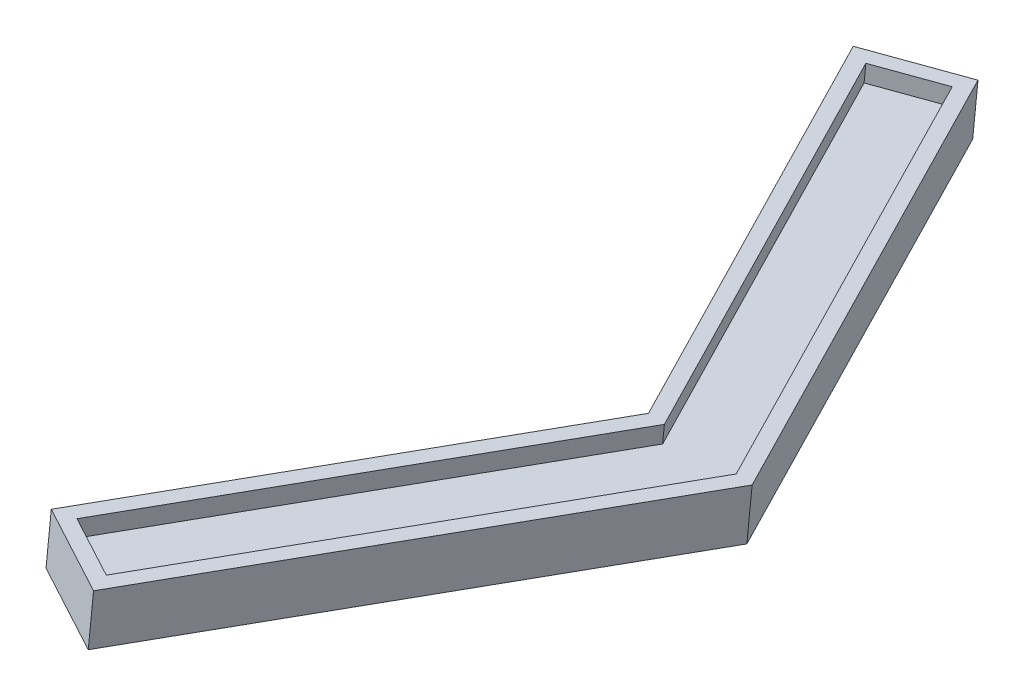
ISO-10303-21;
HEADER;
FILE_DESCRIPTION(('STEP AP214'),'2;1');
FILE_NAME('part.step','',(''),(''),'','','');
FILE_SCHEMA(('AUTOMOTIVE_DESIGN { 1 0 10303 214 1 1 1 1 }'));
ENDSEC;
DATA;
#1=APPLICATION_CONTEXT('core data for automotive mechanical design processes');
#2=APPLICATION_PROTOCOL_DEFINITION('international standard','automotive_design',2000,#1);
#3=PRODUCT_CONTEXT('',#1,'mechanical');
#4=PRODUCT('Part','Part','',(#3));
#5=PRODUCT_RELATED_PRODUCT_CATEGORY('part','',(#4));
#6=PRODUCT_DEFINITION_FORMATION('','',#4);
#7=PRODUCT_DEFINITION_CONTEXT('part definition',#1,'design');
#8=PRODUCT_DEFINITION('design','',#6,#7);
#9=PRODUCT_DEFINITION_SHAPE('','',#8);
#10=(LENGTH_UNIT() NAMED_UNIT(*) SI_UNIT(.MILLI.,.METRE.));
#11=(NAMED_UNIT(*) PLANE_ANGLE_UNIT() SI_UNIT($,.RADIAN.));
#12=(NAMED_UNIT(*) SI_UNIT($,.STERADIAN.) SOLID_ANGLE_UNIT());
#13=UNCERTAINTY_MEASURE_WITH_UNIT(LENGTH_MEASURE(1.E-05),#10,'distance_accuracy_value','');
#14=(GEOMETRIC_REPRESENTATION_CONTEXT(3) GLOBAL_UNCERTAINTY_ASSIGNED_CONTEXT((#13)) GLOBAL_UNIT_ASSIGNED_CONTEXT((#10,
#11,#12)) REPRESENTATION_CONTEXT('',''));
#15=CARTESIAN_POINT('',(0.,0.,0.));
#16=DIRECTION('',(0.,0.,1.));
#17=DIRECTION('',(1.,0.,0.));
#18=AXIS2_PLACEMENT_3D('',#15,#16,#17);
#19=CARTESIAN_POINT('',(69.8076393341287,-27.9262424475834,35.4985146753532));
#20=DIRECTION('',(-0.89309956686046,0.0879120458844193,-0.441185489178956));
#21=DIRECTION('',(-0.44290029244555,0.,0.896570873356728));
#22=AXIS2_PLACEMENT_3D('',#19,#20,#21);
#23=PLANE('',#22);
#24=DIRECTION('',(-0.439063485511292,0.0432191109666863,0.897415937087104));
#25=VECTOR('',#24,1.);
#26=CARTESIAN_POINT('',(69.9545813076072,-26.4334571125702,35.4985146753532));
#27=LINE('',#26,#25);
#28=CARTESIAN_POINT('',(74.039117586404,-26.8355174808452,27.15));
#29=VERTEX_POINT('',#28);
#30=CARTESIAN_POINT('',(68.0232117557028,-26.243343204819,39.4461028339663));
#31=VERTEX_POINT('',#30);
#32=EDGE_CURVE('E134',#29,#31,#27,.T.);
#33=ORIENTED_EDGE('',*,*,#32,.T.);
#34=DIRECTION('',(0.0979613156523277,0.995190223342083,0.));
#35=VECTOR('',#34,1.);
#36=CARTESIAN_POINT('',(67.8762697822244,-27.7361285398321,39.4461028339663));
#37=LINE('',#36,#35);
#38=CARTESIAN_POINT('',(67.8762697822244,-27.7361285398321,39.4461028339663));
#39=VERTEX_POINT('',#38);
#40=EDGE_CURVE('E11',#39,#31,#37,.T.);
#41=ORIENTED_EDGE('',*,*,#40,.F.);
#42=DIRECTION('',(-0.439063485511292,0.0432191109666863,0.897415937087104));
#43=VECTOR('',#42,1.);
#44=CARTESIAN_POINT('',(69.8076393341287,-27.9262424475834,35.4985146753532));
#45=LINE('',#44,#43);
#46=CARTESIAN_POINT('',(73.8921756129255,-28.3283028158584,27.15));
#47=VERTEX_POINT('',#46);
#48=EDGE_CURVE('E146',#47,#39,#45,.T.);
#49=ORIENTED_EDGE('',*,*,#48,.F.);
#50=DIRECTION('',(0.0979613156523277,0.995190223342083,0.));
#51=VECTOR('',#50,1.);
#52=CARTESIAN_POINT('',(73.8921756129255,-28.3283028158584,27.15));
#53=LINE('',#52,#51);
#54=EDGE_CURVE('E130',#47,#29,#53,.T.);
#55=ORIENTED_EDGE('',*,*,#54,.T.);
#56=EDGE_LOOP('',(#33,#41,#49,#55));
#57=FACE_BOUND('',#56,.T.);
#58=ADVANCED_FACE('F38',(#57),#23,.F.);
#59=CARTESIAN_POINT('',(-3.98399955652474,-20.6625798227697,3.94758815861292));
#60=DIRECTION('',(0.439063485511294,-0.0432191109666865,-0.897415937087103));
#61=DIRECTION('',(-0.898255250904785,0.,-0.439474122357599));
#62=AXIS2_PLACEMENT_3D('',#59,#60,#61);
#63=PLANE('',#62);
#64=DIRECTION('',(-0.893099566860459,0.0879120458844191,-0.441185489178958));
#65=VECTOR('',#64,1.);
#66=CARTESIAN_POINT('',(-3.83705758304625,-19.1697944877565,3.94758815861292));
#67=LINE('',#66,#65);
#68=CARTESIAN_POINT('',(65.7011528818657,-26.0147718855195,38.299020562101));
#69=VERTEX_POINT('',#68);
#70=EDGE_CURVE('E137',#31,#69,#67,.T.);
#71=ORIENTED_EDGE('',*,*,#70,.T.);
#72=DIRECTION('',(0.0979613156523277,0.995190223342083,0.));
#73=VECTOR('',#72,1.);
#74=CARTESIAN_POINT('',(65.5542109083872,-27.5075572205326,38.299020562101));
#75=LINE('',#74,#73);
#76=CARTESIAN_POINT('',(65.5542109083872,-27.5075572205326,38.299020562101));
#77=VERTEX_POINT('',#76);
#78=EDGE_CURVE('E45',#77,#69,#75,.T.);
#79=ORIENTED_EDGE('',*,*,#78,.F.);
#80=DIRECTION('',(-0.893099566860459,0.0879120458844191,-0.441185489178958));
#81=VECTOR('',#80,1.);
#82=CARTESIAN_POINT('',(-3.98399955652474,-20.6625798227697,3.94758815861292));
#83=LINE('',#82,#81);
#84=EDGE_CURVE('E96',#39,#77,#83,.T.);
#85=ORIENTED_EDGE('',*,*,#84,.F.);
#86=ORIENTED_EDGE('',*,*,#40,.T.);
#87=EDGE_LOOP('',(#71,#79,#85,#86));
#88=FACE_BOUND('',#87,.T.);
#89=ADVANCED_FACE('F268',(#88),#63,.F.);
#90=CARTESIAN_POINT('',(67.4855804602915,-27.6976711282839,34.3514324034879));
#91=DIRECTION('',(0.89309956686046,-0.0879120458844193,0.441185489178956));
#92=DIRECTION('',(0.44290029244555,0.,-0.896570873356728));
#93=AXIS2_PLACEMENT_3D('',#90,#91,#92);
#94=PLANE('',#93);
#95=DIRECTION('',(0.439063485511291,-0.0432191109666863,-0.897415937087104));
#96=VECTOR('',#95,1.);
#97=CARTESIAN_POINT('',(67.63252243377,-26.2048857932708,34.3514324034879));
#98=LINE('',#97,#96);
#99=CARTESIAN_POINT('',(71.1558452109567,-26.5517032424635,27.15));
#100=VERTEX_POINT('',#99);
#101=EDGE_CURVE('E140',#69,#100,#98,.T.);
#102=ORIENTED_EDGE('',*,*,#101,.T.);
#103=DIRECTION('',(0.0979613156523277,0.995190223342083,0.));
#104=VECTOR('',#103,1.);
#105=CARTESIAN_POINT('',(71.0089032374782,-28.0444885774766,27.15));
#106=LINE('',#105,#104);
#107=CARTESIAN_POINT('',(71.0089032374782,-28.0444885774766,27.15));
#108=VERTEX_POINT('',#107);
#109=EDGE_CURVE('E125',#108,#100,#106,.T.);
#110=ORIENTED_EDGE('',*,*,#109,.F.);
#111=DIRECTION('',(0.439063485511291,-0.0432191109666863,-0.897415937087104));
#112=VECTOR('',#111,1.);
#113=CARTESIAN_POINT('',(67.4855804602915,-27.6976711282839,34.3514324034879));
#114=LINE('',#113,#112);
#115=EDGE_CURVE('E113',#77,#108,#114,.T.);
#116=ORIENTED_EDGE('',*,*,#115,.F.);
#117=ORIENTED_EDGE('',*,*,#78,.T.);
#118=EDGE_LOOP('',(#102,#110,#116,#117));
#119=FACE_BOUND('',#118,.T.);
#120=ADVANCED_FACE('F152',(#119),#94,.F.);
#121=CARTESIAN_POINT('',(46.0901549477987,-25.5916174483084,-23.7822286761772));
#122=DIRECTION('',(0.893099566860461,-0.0879120458844193,-0.441185489178955));
#123=DIRECTION('',(-0.442900292445549,0.,-0.896570873356729));
#124=AXIS2_PLACEMENT_3D('',#121,#122,#123);
#125=PLANE('',#124);
#126=DIRECTION('',(-0.43906348551129,0.0432191109666862,-0.897415937087105));
#127=VECTOR('',#126,1.);
#128=CARTESIAN_POINT('',(46.2370969212772,-24.0988321132953,-23.7822286761772));
#129=LINE('',#128,#127);
#130=CARTESIAN_POINT('',(65.7011528818657,-26.0147718855195,16.000979437899));
#131=VERTEX_POINT('',#130);
#132=EDGE_CURVE('E122',#100,#131,#129,.T.);
#133=ORIENTED_EDGE('',*,*,#132,.T.);
#134=DIRECTION('',(0.0979613156523277,0.995190223342083,0.));
#135=VECTOR('',#134,1.);
#136=CARTESIAN_POINT('',(65.5542109083872,-27.5075572205326,16.000979437899));
#137=LINE('',#136,#135);
#138=CARTESIAN_POINT('',(65.5542109083872,-27.5075572205326,16.000979437899));
#139=VERTEX_POINT('',#138);
#140=EDGE_CURVE('E119',#139,#131,#137,.T.);
#141=ORIENTED_EDGE('',*,*,#140,.F.);
#142=DIRECTION('',(-0.43906348551129,0.0432191109666862,-0.897415937087105));
#143=VECTOR('',#142,1.);
#144=CARTESIAN_POINT('',(46.0901549477987,-25.5916174483084,-23.7822286761772));
#145=LINE('',#144,#143);
#146=EDGE_CURVE('E106',#108,#139,#145,.T.);
#147=ORIENTED_EDGE('',*,*,#146,.F.);
#148=ORIENTED_EDGE('',*,*,#109,.T.);
#149=EDGE_LOOP('',(#133,#141,#147,#148));
#150=FACE_BOUND('',#149,.T.);
#151=ADVANCED_FACE('F120',(#150),#125,.F.);
#152=CARTESIAN_POINT('',(17.4114259559682,-22.7686335027451,39.7832081140763));
#153=DIRECTION('',(0.439063485511292,-0.0432191109666864,0.897415937087104));
#154=DIRECTION('',(0.898255250904786,0.,-0.439474122357597));
#155=AXIS2_PLACEMENT_3D('',#152,#153,#154);
#156=PLANE('',#155);
#157=DIRECTION('',(0.89309956686046,-0.0879120458844192,-0.441185489178957));
#158=VECTOR('',#157,1.);
#159=CARTESIAN_POINT('',(17.5583679294467,-21.275848167732,39.7832081140763));
#160=LINE('',#159,#158);
#161=CARTESIAN_POINT('',(68.0232117557029,-26.243343204819,14.8538971660338));
#162=VERTEX_POINT('',#161);
#163=EDGE_CURVE('E143',#131,#162,#160,.T.);
#164=ORIENTED_EDGE('',*,*,#163,.T.);
#165=DIRECTION('',(0.0979613156523277,0.995190223342083,0.));
#166=VECTOR('',#165,1.);
#167=CARTESIAN_POINT('',(67.8762697822244,-27.7361285398321,14.8538971660338));
#168=LINE('',#167,#166);
#169=CARTESIAN_POINT('',(67.8762697822244,-27.7361285398321,14.8538971660338));
#170=VERTEX_POINT('',#169);
#171=EDGE_CURVE('E126',#170,#162,#168,.T.);
#172=ORIENTED_EDGE('',*,*,#171,.F.);
#173=DIRECTION('',(0.89309956686046,-0.0879120458844192,-0.441185489178957));
#174=VECTOR('',#173,1.);
#175=CARTESIAN_POINT('',(17.4114259559682,-22.7686335027451,39.7832081140763));
#176=LINE('',#175,#174);
#177=EDGE_CURVE('E110',#139,#170,#176,.T.);
#178=ORIENTED_EDGE('',*,*,#177,.F.);
#179=ORIENTED_EDGE('',*,*,#140,.T.);
#180=EDGE_LOOP('',(#164,#172,#178,#179));
#181=FACE_BOUND('',#180,.T.);
#182=ADVANCED_FACE('F128',(#181),#156,.F.);
#183=CARTESIAN_POINT('',(48.4122138216358,-25.8201887676079,-24.9293109480425));
#184=DIRECTION('',(-0.89309956686046,0.0879120458844193,0.441185489178955));
#185=DIRECTION('',(0.44290029244555,0.,0.896570873356728));
#186=AXIS2_PLACEMENT_3D('',#183,#184,#185);
#187=PLANE('',#186);
#188=DIRECTION('',(0.439063485511291,-0.0432191109666862,0.897415937087105));
#189=VECTOR('',#188,1.);
#190=CARTESIAN_POINT('',(48.5591557951143,-24.3274034325948,-24.9293109480425));
#191=LINE('',#190,#189);
#192=EDGE_CURVE('E88',#162,#29,#191,.T.);
#193=ORIENTED_EDGE('',*,*,#192,.T.);
#194=ORIENTED_EDGE('',*,*,#54,.F.);
#195=DIRECTION('',(0.439063485511291,-0.0432191109666862,0.897415937087105));
#196=VECTOR('',#195,1.);
#197=CARTESIAN_POINT('',(48.4122138216358,-25.8201887676079,-24.9293109480425));
#198=LINE('',#197,#196);
#199=EDGE_CURVE('E61',#170,#47,#198,.T.);
#200=ORIENTED_EDGE('',*,*,#199,.F.);
#201=ORIENTED_EDGE('',*,*,#171,.T.);
#202=EDGE_LOOP('',(#193,#194,#200,#201));
#203=FACE_BOUND('',#202,.T.);
#204=ADVANCED_FACE('F156',(#203),#187,.F.);
#205=CARTESIAN_POINT('',(-2.05263000462044,-20.8526937305209,0.));
#206=DIRECTION('',(-0.0979613156523277,-0.995190223342083,0.));
#207=DIRECTION('',(0.995190223342083,-0.0979613156523277,0.));
#208=AXIS2_PLACEMENT_3D('',#205,#206,#207);
#209=PLANE('',#208);
#210=ORIENTED_EDGE('',*,*,#48,.T.);
#211=ORIENTED_EDGE('',*,*,#84,.T.);
#212=ORIENTED_EDGE('',*,*,#115,.T.);
#213=ORIENTED_EDGE('',*,*,#146,.T.);
#214=ORIENTED_EDGE('',*,*,#177,.T.);
#215=ORIENTED_EDGE('',*,*,#199,.T.);
#216=EDGE_LOOP('',(#210,#211,#212,#213,#214,#215));
#217=FACE_BOUND('',#216,.T.);
#218=ADVANCED_FACE('F108',(#217),#209,.T.);
#219=CARTESIAN_POINT('',(-1.90568803114195,-19.3599083955078,0.));
#220=DIRECTION('',(-0.0979613156523277,-0.995190223342083,0.));
#221=DIRECTION('',(0.995190223342083,-0.0979613156523277,0.));
#222=AXIS2_PLACEMENT_3D('',#219,#220,#221);
#223=PLANE('',#222);
#224=DIRECTION('',(-0.893099566860461,0.0879120458844194,0.441185489178953));
#225=VECTOR('',#224,1.);
#226=CARTESIAN_POINT('',(17.7339933236509,-21.2931358121187,40.142174488911));
#227=LINE('',#226,#225);
#228=CARTESIAN_POINT('',(67.8415973231632,-26.2254660308519,15.3893377365402));
#229=VERTEX_POINT('',#228);
#230=CARTESIAN_POINT('',(66.2340181028143,-26.06722434826,16.1834716170623));
#231=VERTEX_POINT('',#230);
#232=EDGE_CURVE('E192',#229,#231,#227,.T.);
#233=ORIENTED_EDGE('',*,*,#232,.F.);
#234=DIRECTION('',(-0.43906348551129,0.0432191109666862,-0.897415937087105));
#235=VECTOR('',#234,1.);
#236=CARTESIAN_POINT('',(48.2019159683702,-24.292238614241,-24.7528367523709));
#237=LINE('',#236,#235);
#238=CARTESIAN_POINT('',(73.5955372209506,-26.7918537518634,27.15));
#239=VERTEX_POINT('',#238);
#240=EDGE_CURVE('E52',#239,#229,#237,.T.);
#241=ORIENTED_EDGE('',*,*,#240,.F.);
#242=DIRECTION('',(0.439063485511291,-0.0432191109666862,-0.897415937087104));
#243=VECTOR('',#242,1.);
#244=CARTESIAN_POINT('',(69.597341480863,-26.3982922942165,35.3220404796815));
#245=LINE('',#244,#243);
#246=CARTESIAN_POINT('',(67.8415973231632,-26.2254660308519,38.9106622634598));
#247=VERTEX_POINT('',#246);
#248=EDGE_CURVE('E179',#247,#239,#245,.T.);
#249=ORIENTED_EDGE('',*,*,#248,.F.);
#250=DIRECTION('',(0.89309956686046,-0.0879120458844193,0.441185489178956));
#251=VECTOR('',#250,1.);
#252=CARTESIAN_POINT('',(-3.66143218884183,-19.1870821321432,3.58862178377831));
#253=LINE('',#252,#251);
#254=CARTESIAN_POINT('',(66.2340181028143,-26.06722434826,38.1165283829377));
#255=VERTEX_POINT('',#254);
#256=EDGE_CURVE('E183',#255,#247,#253,.T.);
#257=ORIENTED_EDGE('',*,*,#256,.F.);
#258=DIRECTION('',(-0.439063485511291,0.0432191109666862,0.897415937087104));
#259=VECTOR('',#258,1.);
#260=CARTESIAN_POINT('',(67.9897622605142,-26.2400506116245,34.5279065991594));
#261=LINE('',#260,#259);
#262=CARTESIAN_POINT('',(71.5994255764101,-26.5953669714453,27.15));
#263=VERTEX_POINT('',#262);
#264=EDGE_CURVE('E186',#263,#255,#261,.T.);
#265=ORIENTED_EDGE('',*,*,#264,.F.);
#266=DIRECTION('',(0.43906348551129,-0.0432191109666862,0.897415937087105));
#267=VECTOR('',#266,1.);
#268=CARTESIAN_POINT('',(46.5943367480214,-24.1339969316491,-23.9587028718488));
#269=LINE('',#268,#267);
#270=EDGE_CURVE('E189',#231,#263,#269,.T.);
#271=ORIENTED_EDGE('',*,*,#270,.F.);
#272=EDGE_LOOP('',(#233,#241,#249,#257,#265,#271));
#273=FACE_BOUND('',#272,.T.);
#274=ORIENTED_EDGE('',*,*,#32,.F.);
#275=ORIENTED_EDGE('',*,*,#192,.F.);
#276=ORIENTED_EDGE('',*,*,#163,.F.);
#277=ORIENTED_EDGE('',*,*,#132,.F.);
#278=ORIENTED_EDGE('',*,*,#101,.F.);
#279=ORIENTED_EDGE('',*,*,#70,.F.);
#280=EDGE_LOOP('',(#274,#275,#276,#277,#278,#279));
#281=FACE_BOUND('',#280,.T.);
#282=ADVANCED_FACE('F155',(#273,#281),#223,.F.);
#283=CARTESIAN_POINT('',(48.152935310544,-24.7898337259121,-24.7528367523709));
#284=DIRECTION('',(0.89309956686046,-0.0879120458844193,-0.441185489178955));
#285=DIRECTION('',(-0.442900292445549,0.,-0.896570873356729));
#286=AXIS2_PLACEMENT_3D('',#283,#284,#285);
#287=PLANE('',#286);
#288=ORIENTED_EDGE('',*,*,#240,.T.);
#289=DIRECTION('',(0.0979613156523277,0.995190223342083,0.));
#290=VECTOR('',#289,1.);
#291=CARTESIAN_POINT('',(67.792616665337,-26.723061142523,15.3893377365402));
#292=LINE('',#291,#290);
#293=CARTESIAN_POINT('',(67.792616665337,-26.723061142523,15.3893377365402));
#294=VERTEX_POINT('',#293);
#295=EDGE_CURVE('E163',#294,#229,#292,.T.);
#296=ORIENTED_EDGE('',*,*,#295,.F.);
#297=DIRECTION('',(-0.43906348551129,0.0432191109666862,-0.897415937087105));
#298=VECTOR('',#297,1.);
#299=CARTESIAN_POINT('',(48.152935310544,-24.7898337259121,-24.7528367523709));
#300=LINE('',#299,#298);
#301=CARTESIAN_POINT('',(73.5465565631244,-27.2894488635345,27.15));
#302=VERTEX_POINT('',#301);
#303=EDGE_CURVE('E182',#302,#294,#300,.T.);
#304=ORIENTED_EDGE('',*,*,#303,.F.);
#305=DIRECTION('',(0.0979613156523277,0.995190223342083,0.));
#306=VECTOR('',#305,1.);
#307=CARTESIAN_POINT('',(73.5465565631244,-27.2894488635345,27.15));
#308=LINE('',#307,#306);
#309=EDGE_CURVE('E138',#302,#239,#308,.T.);
#310=ORIENTED_EDGE('',*,*,#309,.T.);
#311=EDGE_LOOP('',(#288,#296,#304,#310));
#312=FACE_BOUND('',#311,.T.);
#313=ADVANCED_FACE('F219',(#312),#287,.F.);
#314=CARTESIAN_POINT('',(69.5483608230369,-26.8958874058875,35.3220404796815));
#315=DIRECTION('',(0.89309956686046,-0.0879120458844193,0.441185489178956));
#316=DIRECTION('',(0.44290029244555,0.,-0.896570873356728));
#317=AXIS2_PLACEMENT_3D('',#314,#315,#316);
#318=PLANE('',#317);
#319=ORIENTED_EDGE('',*,*,#248,.T.);
#320=ORIENTED_EDGE('',*,*,#309,.F.);
#321=DIRECTION('',(0.439063485511291,-0.0432191109666862,-0.897415937087104));
#322=VECTOR('',#321,1.);
#323=CARTESIAN_POINT('',(69.5483608230369,-26.8958874058875,35.3220404796815));
#324=LINE('',#323,#322);
#325=CARTESIAN_POINT('',(67.792616665337,-26.723061142523,38.9106622634598));
#326=VERTEX_POINT('',#325);
#327=EDGE_CURVE('E166',#326,#302,#324,.T.);
#328=ORIENTED_EDGE('',*,*,#327,.F.);
#329=DIRECTION('',(0.0979613156523277,0.995190223342083,0.));
#330=VECTOR('',#329,1.);
#331=CARTESIAN_POINT('',(67.792616665337,-26.723061142523,38.9106622634598));
#332=LINE('',#331,#330);
#333=EDGE_CURVE('E175',#326,#247,#332,.T.);
#334=ORIENTED_EDGE('',*,*,#333,.T.);
#335=EDGE_LOOP('',(#319,#320,#328,#334));
#336=FACE_BOUND('',#335,.T.);
#337=ADVANCED_FACE('F235',(#336),#318,.F.);
#338=CARTESIAN_POINT('',(-3.710412846668,-19.6846772438143,3.58862178377831));
#339=DIRECTION('',(-0.439063485511291,0.0432191109666863,0.897415937087104));
#340=DIRECTION('',(0.898255250904786,0.,0.439474122357596));
#341=AXIS2_PLACEMENT_3D('',#338,#339,#340);
#342=PLANE('',#341);
#343=ORIENTED_EDGE('',*,*,#256,.T.);
#344=ORIENTED_EDGE('',*,*,#333,.F.);
#345=DIRECTION('',(0.89309956686046,-0.0879120458844193,0.441185489178956));
#346=VECTOR('',#345,1.);
#347=CARTESIAN_POINT('',(-3.710412846668,-19.6846772438143,3.58862178377831));
#348=LINE('',#347,#346);
#349=CARTESIAN_POINT('',(66.1850374449882,-26.564819459931,38.1165283829377));
#350=VERTEX_POINT('',#349);
#351=EDGE_CURVE('E198',#350,#326,#348,.T.);
#352=ORIENTED_EDGE('',*,*,#351,.F.);
#353=DIRECTION('',(0.0979613156523277,0.995190223342083,0.));
#354=VECTOR('',#353,1.);
#355=CARTESIAN_POINT('',(66.1850374449882,-26.564819459931,38.1165283829377));
#356=LINE('',#355,#354);
#357=EDGE_CURVE('E172',#350,#255,#356,.T.);
#358=ORIENTED_EDGE('',*,*,#357,.T.);
#359=EDGE_LOOP('',(#343,#344,#352,#358));
#360=FACE_BOUND('',#359,.T.);
#361=ADVANCED_FACE('F240',(#360),#342,.F.);
#362=CARTESIAN_POINT('',(67.940781602688,-26.7376457232956,34.5279065991594));
#363=DIRECTION('',(-0.89309956686046,0.0879120458844193,-0.441185489178956));
#364=DIRECTION('',(-0.44290029244555,0.,0.896570873356728));
#365=AXIS2_PLACEMENT_3D('',#362,#363,#364);
#366=PLANE('',#365);
#367=ORIENTED_EDGE('',*,*,#264,.T.);
#368=ORIENTED_EDGE('',*,*,#357,.F.);
#369=DIRECTION('',(-0.439063485511291,0.0432191109666862,0.897415937087104));
#370=VECTOR('',#369,1.);
#371=CARTESIAN_POINT('',(67.940781602688,-26.7376457232956,34.5279065991594));
#372=LINE('',#371,#370);
#373=CARTESIAN_POINT('',(71.550444918584,-27.0929620831163,27.15));
#374=VERTEX_POINT('',#373);
#375=EDGE_CURVE('E201',#374,#350,#372,.T.);
#376=ORIENTED_EDGE('',*,*,#375,.F.);
#377=DIRECTION('',(0.0979613156523277,0.995190223342083,0.));
#378=VECTOR('',#377,1.);
#379=CARTESIAN_POINT('',(71.550444918584,-27.0929620831163,27.15));
#380=LINE('',#379,#378);
#381=EDGE_CURVE('E169',#374,#263,#380,.T.);
#382=ORIENTED_EDGE('',*,*,#381,.T.);
#383=EDGE_LOOP('',(#367,#368,#376,#382));
#384=FACE_BOUND('',#383,.T.);
#385=ADVANCED_FACE('F258',(#384),#366,.F.);
#386=CARTESIAN_POINT('',(46.5453560901952,-24.6315920433201,-23.9587028718488));
#387=DIRECTION('',(-0.893099566860461,0.0879120458844193,0.441185489178955));
#388=DIRECTION('',(0.442900292445549,0.,0.896570873356729));
#389=AXIS2_PLACEMENT_3D('',#386,#387,#388);
#390=PLANE('',#389);
#391=ORIENTED_EDGE('',*,*,#270,.T.);
#392=ORIENTED_EDGE('',*,*,#381,.F.);
#393=DIRECTION('',(0.43906348551129,-0.0432191109666862,0.897415937087105));
#394=VECTOR('',#393,1.);
#395=CARTESIAN_POINT('',(46.5453560901952,-24.6315920433201,-23.9587028718488));
#396=LINE('',#395,#394);
#397=CARTESIAN_POINT('',(66.1850374449882,-26.564819459931,16.1834716170623));
#398=VERTEX_POINT('',#397);
#399=EDGE_CURVE('E204',#398,#374,#396,.T.);
#400=ORIENTED_EDGE('',*,*,#399,.F.);
#401=DIRECTION('',(0.0979613156523277,0.995190223342083,0.));
#402=VECTOR('',#401,1.);
#403=CARTESIAN_POINT('',(66.1850374449882,-26.564819459931,16.1834716170623));
#404=LINE('',#403,#402);
#405=EDGE_CURVE('E165',#398,#231,#404,.T.);
#406=ORIENTED_EDGE('',*,*,#405,.T.);
#407=EDGE_LOOP('',(#391,#392,#400,#406));
#408=FACE_BOUND('',#407,.T.);
#409=ADVANCED_FACE('F254',(#408),#390,.F.);
#410=CARTESIAN_POINT('',(17.6850126658248,-21.7907309237897,40.142174488911));
#411=DIRECTION('',(-0.439063485511289,0.043219110966686,-0.897415937087106));
#412=DIRECTION('',(-0.898255250904788,0.,0.439474122357594));
#413=AXIS2_PLACEMENT_3D('',#410,#411,#412);
#414=PLANE('',#413);
#415=ORIENTED_EDGE('',*,*,#232,.T.);
#416=ORIENTED_EDGE('',*,*,#405,.F.);
#417=DIRECTION('',(-0.893099566860461,0.0879120458844194,0.441185489178953));
#418=VECTOR('',#417,1.);
#419=CARTESIAN_POINT('',(17.6850126658248,-21.7907309237897,40.142174488911));
#420=LINE('',#419,#418);
#421=EDGE_CURVE('E207',#294,#398,#420,.T.);
#422=ORIENTED_EDGE('',*,*,#421,.F.);
#423=ORIENTED_EDGE('',*,*,#295,.T.);
#424=EDGE_LOOP('',(#415,#416,#422,#423));
#425=FACE_BOUND('',#424,.T.);
#426=ADVANCED_FACE('F248',(#425),#414,.F.);
#427=CARTESIAN_POINT('',(-1.95466868896811,-19.8575035071788,0.));
#428=DIRECTION('',(0.0979613156523277,0.995190223342083,0.));
#429=DIRECTION('',(-0.995190223342083,0.0979613156523277,0.));
#430=AXIS2_PLACEMENT_3D('',#427,#428,#429);
#431=PLANE('',#430);
#432=ORIENTED_EDGE('',*,*,#303,.T.);
#433=ORIENTED_EDGE('',*,*,#421,.T.);
#434=ORIENTED_EDGE('',*,*,#399,.T.);
#435=ORIENTED_EDGE('',*,*,#375,.T.);
#436=ORIENTED_EDGE('',*,*,#351,.T.);
#437=ORIENTED_EDGE('',*,*,#327,.T.);
#438=EDGE_LOOP('',(#432,#433,#434,#435,#436,#437));
#439=FACE_BOUND('',#438,.T.);
#440=ADVANCED_FACE('F214',(#439),#431,.T.);
#441=CLOSED_SHELL('',(#58,#89,#120,#151,#182,#204,#218,#282,#313,#337,#361,#385,#409,#426,#440));
#442=MANIFOLD_SOLID_BREP('B2',#441);
#443=ADVANCED_BREP_SHAPE_REPRESENTATION('',(#18,#442),#14);
#444=SHAPE_DEFINITION_REPRESENTATION(#9,#443);
ENDSEC;
END-ISO-10303-21;
